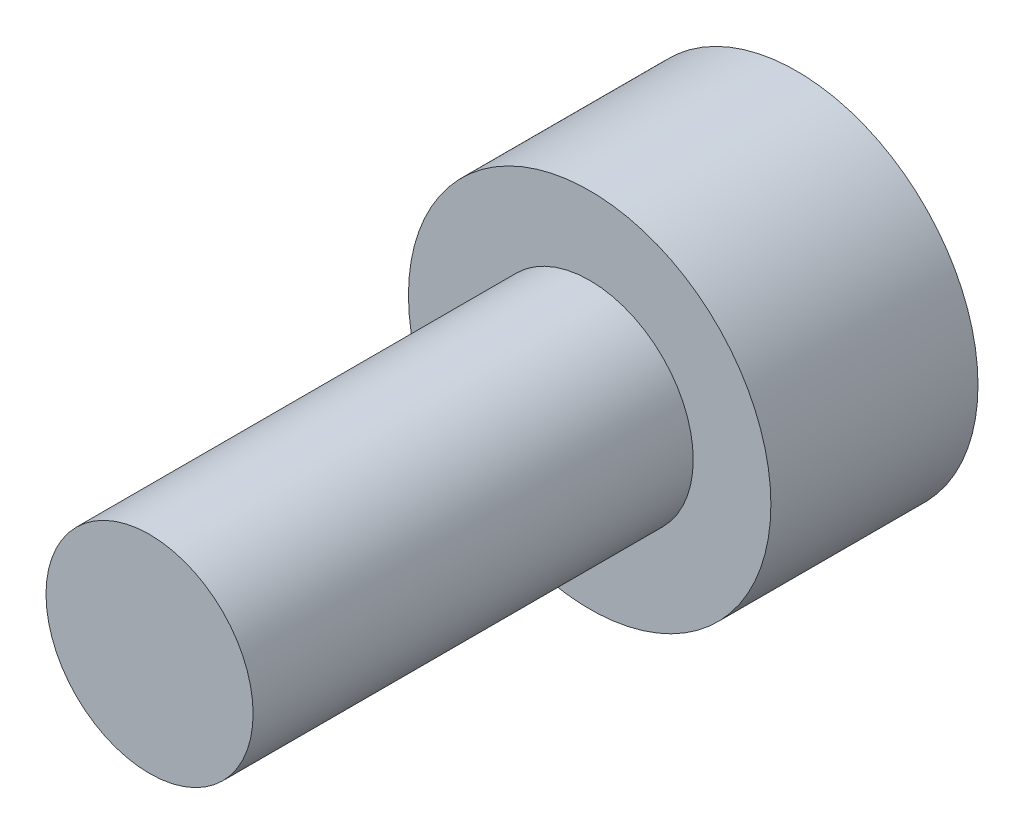
ISO-10303-21;
HEADER;
FILE_DESCRIPTION(('STEP AP214'),'2;1');
FILE_NAME('part.step','',(''),(''),'','','');
FILE_SCHEMA(('AUTOMOTIVE_DESIGN { 1 0 10303 214 1 1 1 1 }'));
ENDSEC;
DATA;
#1=APPLICATION_CONTEXT('core data for automotive mechanical design processes');
#2=APPLICATION_PROTOCOL_DEFINITION('international standard','automotive_design',2000,#1);
#3=PRODUCT_CONTEXT('',#1,'mechanical');
#4=PRODUCT('Part','Part','',(#3));
#5=PRODUCT_RELATED_PRODUCT_CATEGORY('part','',(#4));
#6=PRODUCT_DEFINITION_FORMATION('','',#4);
#7=PRODUCT_DEFINITION_CONTEXT('part definition',#1,'design');
#8=PRODUCT_DEFINITION('design','',#6,#7);
#9=PRODUCT_DEFINITION_SHAPE('','',#8);
#10=(LENGTH_UNIT() NAMED_UNIT(*) SI_UNIT(.MILLI.,.METRE.));
#11=(NAMED_UNIT(*) PLANE_ANGLE_UNIT() SI_UNIT($,.RADIAN.));
#12=(NAMED_UNIT(*) SI_UNIT($,.STERADIAN.) SOLID_ANGLE_UNIT());
#13=UNCERTAINTY_MEASURE_WITH_UNIT(LENGTH_MEASURE(1.E-05),#10,'distance_accuracy_value','');
#14=(GEOMETRIC_REPRESENTATION_CONTEXT(3) GLOBAL_UNCERTAINTY_ASSIGNED_CONTEXT((#13)) GLOBAL_UNIT_ASSIGNED_CONTEXT((#10,
#11,#12)) REPRESENTATION_CONTEXT('',''));
#15=CARTESIAN_POINT('',(0.,0.,0.));
#16=DIRECTION('',(0.,0.,1.));
#17=DIRECTION('',(1.,0.,0.));
#18=AXIS2_PLACEMENT_3D('',#15,#16,#17);
#19=CARTESIAN_POINT('',(0.,0.,3.6));
#20=DIRECTION('',(0.,0.,1.));
#21=DIRECTION('',(1.,0.,0.));
#22=AXIS2_PLACEMENT_3D('',#19,#20,#21);
#23=PLANE('',#22);
#24=DIRECTION('',(0.,-1.,0.));
#25=VECTOR('',#24,1.);
#26=CARTESIAN_POINT('',(-1.5,0.866025403784439,3.6));
#27=LINE('',#26,#25);
#28=CARTESIAN_POINT('',(-1.5,0.866025403784439,3.6));
#29=VERTEX_POINT('',#28);
#30=CARTESIAN_POINT('',(-1.5,-0.866025403784439,3.6));
#31=VERTEX_POINT('',#30);
#32=EDGE_CURVE('E183',#29,#31,#27,.T.);
#33=ORIENTED_EDGE('',*,*,#32,.F.);
#34=DIRECTION('',(-0.866025403784439,-0.5,0.));
#35=VECTOR('',#34,1.);
#36=CARTESIAN_POINT('',(0.,1.73205080756888,3.6));
#37=LINE('',#36,#35);
#38=CARTESIAN_POINT('',(0.,1.73205080756888,3.6));
#39=VERTEX_POINT('',#38);
#40=EDGE_CURVE('E11',#39,#29,#37,.T.);
#41=ORIENTED_EDGE('',*,*,#40,.F.);
#42=DIRECTION('',(-0.866025403784439,0.5,0.));
#43=VECTOR('',#42,1.);
#44=CARTESIAN_POINT('',(1.5,0.866025403784439,3.6));
#45=LINE('',#44,#43);
#46=CARTESIAN_POINT('',(1.5,0.866025403784438,3.6));
#47=VERTEX_POINT('',#46);
#48=EDGE_CURVE('E97',#47,#39,#45,.T.);
#49=ORIENTED_EDGE('',*,*,#48,.F.);
#50=DIRECTION('',(0.,1.,0.));
#51=VECTOR('',#50,1.);
#52=CARTESIAN_POINT('',(1.5,-0.866025403784439,3.6));
#53=LINE('',#52,#51);
#54=CARTESIAN_POINT('',(1.5,-0.866025403784439,3.6));
#55=VERTEX_POINT('',#54);
#56=EDGE_CURVE('E96',#55,#47,#53,.T.);
#57=ORIENTED_EDGE('',*,*,#56,.F.);
#58=DIRECTION('',(0.866025403784439,0.5,0.));
#59=VECTOR('',#58,1.);
#60=CARTESIAN_POINT('',(0.,-1.73205080756888,3.6));
#61=LINE('',#60,#59);
#62=CARTESIAN_POINT('',(0.,-1.73205080756888,3.6));
#63=VERTEX_POINT('',#62);
#64=EDGE_CURVE('E89',#63,#55,#61,.T.);
#65=ORIENTED_EDGE('',*,*,#64,.F.);
#66=DIRECTION('',(0.866025403784439,-0.5,0.));
#67=VECTOR('',#66,1.);
#68=CARTESIAN_POINT('',(-1.5,-0.866025403784439,3.6));
#69=LINE('',#68,#67);
#70=EDGE_CURVE('E124',#31,#63,#69,.T.);
#71=ORIENTED_EDGE('',*,*,#70,.F.);
#72=EDGE_LOOP('',(#33,#41,#49,#57,#65,#71));
#73=FACE_BOUND('',#72,.T.);
#74=ADVANCED_FACE('F17',(#73),#23,.F.);
#75=CARTESIAN_POINT('',(0.,1.73205080756888,3.6));
#76=DIRECTION('',(0.5,-0.866025403784439,0.));
#77=DIRECTION('',(0.,0.,-1.));
#78=AXIS2_PLACEMENT_3D('',#75,#76,#77);
#79=PLANE('',#78);
#80=DIRECTION('',(-0.866025403784439,-0.5,0.));
#81=VECTOR('',#80,1.);
#82=CARTESIAN_POINT('',(0.,1.73205080756888,0.));
#83=LINE('',#82,#81);
#84=CARTESIAN_POINT('',(0.,1.73205080756888,0.));
#85=VERTEX_POINT('',#84);
#86=CARTESIAN_POINT('',(-1.5,0.866025403784438,0.));
#87=VERTEX_POINT('',#86);
#88=EDGE_CURVE('E142',#85,#87,#83,.T.);
#89=ORIENTED_EDGE('',*,*,#88,.F.);
#90=DIRECTION('',(0.,0.,-1.));
#91=VECTOR('',#90,1.);
#92=CARTESIAN_POINT('',(0.,1.73205080756888,3.6));
#93=LINE('',#92,#91);
#94=EDGE_CURVE('E30',#39,#85,#93,.T.);
#95=ORIENTED_EDGE('',*,*,#94,.F.);
#96=ORIENTED_EDGE('',*,*,#40,.T.);
#97=DIRECTION('',(0.,0.,-1.));
#98=VECTOR('',#97,1.);
#99=CARTESIAN_POINT('',(-1.5,0.866025403784439,3.6));
#100=LINE('',#99,#98);
#101=EDGE_CURVE('E144',#29,#87,#100,.T.);
#102=ORIENTED_EDGE('',*,*,#101,.T.);
#103=EDGE_LOOP('',(#89,#95,#96,#102));
#104=FACE_BOUND('',#103,.T.);
#105=ADVANCED_FACE('F141',(#104),#79,.T.);
#106=CARTESIAN_POINT('',(1.5,0.866025403784439,3.6));
#107=DIRECTION('',(-0.5,-0.866025403784439,0.));
#108=DIRECTION('',(-0.866025403784439,0.5,0.));
#109=AXIS2_PLACEMENT_3D('',#106,#107,#108);
#110=PLANE('',#109);
#111=DIRECTION('',(-0.866025403784439,0.5,0.));
#112=VECTOR('',#111,1.);
#113=CARTESIAN_POINT('',(1.5,0.866025403784439,0.));
#114=LINE('',#113,#112);
#115=CARTESIAN_POINT('',(1.5,0.866025403784438,0.));
#116=VERTEX_POINT('',#115);
#117=EDGE_CURVE('E137',#116,#85,#114,.T.);
#118=ORIENTED_EDGE('',*,*,#117,.F.);
#119=DIRECTION('',(0.,0.,-1.));
#120=VECTOR('',#119,1.);
#121=CARTESIAN_POINT('',(1.5,0.866025403784438,3.6));
#122=LINE('',#121,#120);
#123=EDGE_CURVE('E102',#47,#116,#122,.T.);
#124=ORIENTED_EDGE('',*,*,#123,.F.);
#125=ORIENTED_EDGE('',*,*,#48,.T.);
#126=ORIENTED_EDGE('',*,*,#94,.T.);
#127=EDGE_LOOP('',(#118,#124,#125,#126));
#128=FACE_BOUND('',#127,.T.);
#129=ADVANCED_FACE('F19',(#128),#110,.T.);
#130=CARTESIAN_POINT('',(1.5,-0.866025403784439,3.6));
#131=DIRECTION('',(-1.,0.,0.));
#132=DIRECTION('',(0.,0.,1.));
#133=AXIS2_PLACEMENT_3D('',#130,#131,#132);
#134=PLANE('',#133);
#135=DIRECTION('',(0.,1.,0.));
#136=VECTOR('',#135,1.);
#137=CARTESIAN_POINT('',(1.5,-0.866025403784439,0.));
#138=LINE('',#137,#136);
#139=CARTESIAN_POINT('',(1.5,-0.866025403784439,0.));
#140=VERTEX_POINT('',#139);
#141=EDGE_CURVE('E109',#140,#116,#138,.T.);
#142=ORIENTED_EDGE('',*,*,#141,.F.);
#143=DIRECTION('',(0.,0.,-1.));
#144=VECTOR('',#143,1.);
#145=CARTESIAN_POINT('',(1.5,-0.866025403784439,3.6));
#146=LINE('',#145,#144);
#147=EDGE_CURVE('E104',#55,#140,#146,.T.);
#148=ORIENTED_EDGE('',*,*,#147,.F.);
#149=ORIENTED_EDGE('',*,*,#56,.T.);
#150=ORIENTED_EDGE('',*,*,#123,.T.);
#151=EDGE_LOOP('',(#142,#148,#149,#150));
#152=FACE_BOUND('',#151,.T.);
#153=ADVANCED_FACE('F107',(#152),#134,.T.);
#154=CARTESIAN_POINT('',(0.,-1.73205080756888,3.6));
#155=DIRECTION('',(-0.5,0.866025403784439,0.));
#156=DIRECTION('',(0.,0.,1.));
#157=AXIS2_PLACEMENT_3D('',#154,#155,#156);
#158=PLANE('',#157);
#159=DIRECTION('',(0.866025403784439,0.5,0.));
#160=VECTOR('',#159,1.);
#161=CARTESIAN_POINT('',(0.,-1.73205080756888,0.));
#162=LINE('',#161,#160);
#163=CARTESIAN_POINT('',(0.,-1.73205080756888,0.));
#164=VERTEX_POINT('',#163);
#165=EDGE_CURVE('E172',#164,#140,#162,.T.);
#166=ORIENTED_EDGE('',*,*,#165,.F.);
#167=DIRECTION('',(0.,0.,-1.));
#168=VECTOR('',#167,1.);
#169=CARTESIAN_POINT('',(0.,-1.73205080756888,3.6));
#170=LINE('',#169,#168);
#171=EDGE_CURVE('E117',#63,#164,#170,.T.);
#172=ORIENTED_EDGE('',*,*,#171,.F.);
#173=ORIENTED_EDGE('',*,*,#64,.T.);
#174=ORIENTED_EDGE('',*,*,#147,.T.);
#175=EDGE_LOOP('',(#166,#172,#173,#174));
#176=FACE_BOUND('',#175,.T.);
#177=ADVANCED_FACE('F116',(#176),#158,.T.);
#178=CARTESIAN_POINT('',(-1.5,-0.866025403784439,3.6));
#179=DIRECTION('',(0.5,0.866025403784439,0.));
#180=DIRECTION('',(0.,0.,-1.));
#181=AXIS2_PLACEMENT_3D('',#178,#179,#180);
#182=PLANE('',#181);
#183=DIRECTION('',(0.866025403784439,-0.5,0.));
#184=VECTOR('',#183,1.);
#185=CARTESIAN_POINT('',(-1.5,-0.866025403784439,0.));
#186=LINE('',#185,#184);
#187=CARTESIAN_POINT('',(-1.5,-0.866025403784439,0.));
#188=VERTEX_POINT('',#187);
#189=EDGE_CURVE('E169',#188,#164,#186,.T.);
#190=ORIENTED_EDGE('',*,*,#189,.F.);
#191=DIRECTION('',(0.,0.,-1.));
#192=VECTOR('',#191,1.);
#193=CARTESIAN_POINT('',(-1.5,-0.866025403784439,3.6));
#194=LINE('',#193,#192);
#195=EDGE_CURVE('E177',#31,#188,#194,.T.);
#196=ORIENTED_EDGE('',*,*,#195,.F.);
#197=ORIENTED_EDGE('',*,*,#70,.T.);
#198=ORIENTED_EDGE('',*,*,#171,.T.);
#199=EDGE_LOOP('',(#190,#196,#197,#198));
#200=FACE_BOUND('',#199,.T.);
#201=ADVANCED_FACE('F342',(#200),#182,.T.);
#202=CARTESIAN_POINT('',(-1.5,0.866025403784439,3.6));
#203=DIRECTION('',(1.,0.,0.));
#204=DIRECTION('',(0.,1.,0.));
#205=AXIS2_PLACEMENT_3D('',#202,#203,#204);
#206=PLANE('',#205);
#207=DIRECTION('',(0.,-1.,0.));
#208=VECTOR('',#207,1.);
#209=CARTESIAN_POINT('',(-1.5,0.866025403784439,0.));
#210=LINE('',#209,#208);
#211=EDGE_CURVE('E147',#87,#188,#210,.T.);
#212=ORIENTED_EDGE('',*,*,#211,.F.);
#213=ORIENTED_EDGE('',*,*,#101,.F.);
#214=ORIENTED_EDGE('',*,*,#32,.T.);
#215=ORIENTED_EDGE('',*,*,#195,.T.);
#216=EDGE_LOOP('',(#212,#213,#214,#215));
#217=FACE_BOUND('',#216,.T.);
#218=ADVANCED_FACE('F333',(#217),#206,.T.);
#219=CARTESIAN_POINT('',(0.,0.,4.));
#220=DIRECTION('',(0.,0.,-1.));
#221=DIRECTION('',(0.,-1.,0.));
#222=AXIS2_PLACEMENT_3D('',#219,#220,#221);
#223=PLANE('',#222);
#224=CARTESIAN_POINT('',(0.,0.,4.));
#225=DIRECTION('',(0.,0.,-1.));
#226=DIRECTION('',(-1.,0.,0.));
#227=AXIS2_PLACEMENT_3D('',#224,#225,#226);
#228=CIRCLE('',#227,2.);
#229=CARTESIAN_POINT('',(2.,0.,4.));
#230=VERTEX_POINT('',#229);
#231=EDGE_CURVE('E161',#230,#230,#228,.T.);
#232=ORIENTED_EDGE('',*,*,#231,.T.);
#233=EDGE_LOOP('',(#232));
#234=FACE_BOUND('',#233,.T.);
#235=CARTESIAN_POINT('',(0.,0.,4.));
#236=DIRECTION('',(0.,0.,-1.));
#237=DIRECTION('',(-1.,0.,0.));
#238=AXIS2_PLACEMENT_3D('',#235,#236,#237);
#239=CIRCLE('',#238,3.5);
#240=CARTESIAN_POINT('',(3.5,0.,4.));
#241=VERTEX_POINT('',#240);
#242=EDGE_CURVE('E164',#241,#241,#239,.T.);
#243=ORIENTED_EDGE('',*,*,#242,.F.);
#244=EDGE_LOOP('',(#243));
#245=FACE_BOUND('',#244,.T.);
#246=ADVANCED_FACE('F206',(#234,#245),#223,.F.);
#247=CARTESIAN_POINT('',(0.,0.,0.));
#248=DIRECTION('',(0.,0.,1.));
#249=DIRECTION('',(-1.,0.,0.));
#250=AXIS2_PLACEMENT_3D('',#247,#248,#249);
#251=CYLINDRICAL_SURFACE('',#250,3.5);
#252=ORIENTED_EDGE('',*,*,#242,.T.);
#253=DIRECTION('',(0.,0.,-1.));
#254=VECTOR('',#253,1.);
#255=CARTESIAN_POINT('',(3.5,0.,0.));
#256=LINE('',#255,#254);
#257=CARTESIAN_POINT('',(3.5,0.,0.));
#258=VERTEX_POINT('',#257);
#259=EDGE_CURVE('E179',#241,#258,#256,.T.);
#260=ORIENTED_EDGE('',*,*,#259,.T.);
#261=CARTESIAN_POINT('',(0.,0.,0.));
#262=DIRECTION('',(0.,0.,-1.));
#263=DIRECTION('',(-1.,0.,0.));
#264=AXIS2_PLACEMENT_3D('',#261,#262,#263);
#265=CIRCLE('',#264,3.5);
#266=EDGE_CURVE('E154',#258,#258,#265,.T.);
#267=ORIENTED_EDGE('',*,*,#266,.F.);
#268=ORIENTED_EDGE('',*,*,#259,.F.);
#269=EDGE_LOOP('',(#252,#260,#267,#268));
#270=FACE_BOUND('',#269,.T.);
#271=ADVANCED_FACE('F308',(#270),#251,.T.);
#272=CARTESIAN_POINT('',(0.,3.5,0.));
#273=DIRECTION('',(0.,0.,1.));
#274=DIRECTION('',(1.,0.,0.));
#275=AXIS2_PLACEMENT_3D('',#272,#273,#274);
#276=PLANE('',#275);
#277=ORIENTED_EDGE('',*,*,#117,.T.);
#278=ORIENTED_EDGE('',*,*,#88,.T.);
#279=ORIENTED_EDGE('',*,*,#211,.T.);
#280=ORIENTED_EDGE('',*,*,#189,.T.);
#281=ORIENTED_EDGE('',*,*,#165,.T.);
#282=ORIENTED_EDGE('',*,*,#141,.T.);
#283=EDGE_LOOP('',(#277,#278,#279,#280,#281,#282));
#284=FACE_BOUND('',#283,.T.);
#285=ORIENTED_EDGE('',*,*,#266,.T.);
#286=EDGE_LOOP('',(#285));
#287=FACE_BOUND('',#286,.T.);
#288=ADVANCED_FACE('F155',(#284,#287),#276,.F.);
#289=CARTESIAN_POINT('',(0.,0.,12.5));
#290=DIRECTION('',(0.,0.,-1.));
#291=DIRECTION('',(0.,-1.,0.));
#292=AXIS2_PLACEMENT_3D('',#289,#290,#291);
#293=PLANE('',#292);
#294=CARTESIAN_POINT('',(0.,0.,12.5));
#295=DIRECTION('',(0.,0.,-1.));
#296=DIRECTION('',(-1.,0.,0.));
#297=AXIS2_PLACEMENT_3D('',#294,#295,#296);
#298=CIRCLE('',#297,2.);
#299=CARTESIAN_POINT('',(2.,0.,12.5));
#300=VERTEX_POINT('',#299);
#301=EDGE_CURVE('E194',#300,#300,#298,.T.);
#302=ORIENTED_EDGE('',*,*,#301,.F.);
#303=EDGE_LOOP('',(#302));
#304=FACE_BOUND('',#303,.T.);
#305=ADVANCED_FACE('F291',(#304),#293,.F.);
#306=CARTESIAN_POINT('',(0.,0.,0.));
#307=DIRECTION('',(0.,0.,1.));
#308=DIRECTION('',(-1.,0.,0.));
#309=AXIS2_PLACEMENT_3D('',#306,#307,#308);
#310=CYLINDRICAL_SURFACE('',#309,2.);
#311=ORIENTED_EDGE('',*,*,#301,.T.);
#312=DIRECTION('',(0.,0.,-1.));
#313=VECTOR('',#312,1.);
#314=CARTESIAN_POINT('',(2.,0.,0.));
#315=LINE('',#314,#313);
#316=EDGE_CURVE('E197',#300,#230,#315,.T.);
#317=ORIENTED_EDGE('',*,*,#316,.T.);
#318=ORIENTED_EDGE('',*,*,#231,.F.);
#319=ORIENTED_EDGE('',*,*,#316,.F.);
#320=EDGE_LOOP('',(#311,#317,#318,#319));
#321=FACE_BOUND('',#320,.T.);
#322=ADVANCED_FACE('F211',(#321),#310,.T.);
#323=CLOSED_SHELL('',(#74,#105,#129,#153,#177,#201,#218,#246,#271,#288,#305,#322));
#324=MANIFOLD_SOLID_BREP('B1',#323);
#325=ADVANCED_BREP_SHAPE_REPRESENTATION('',(#18,#324),#14);
#326=SHAPE_DEFINITION_REPRESENTATION(#9,#325);
ENDSEC;
END-ISO-10303-21;
